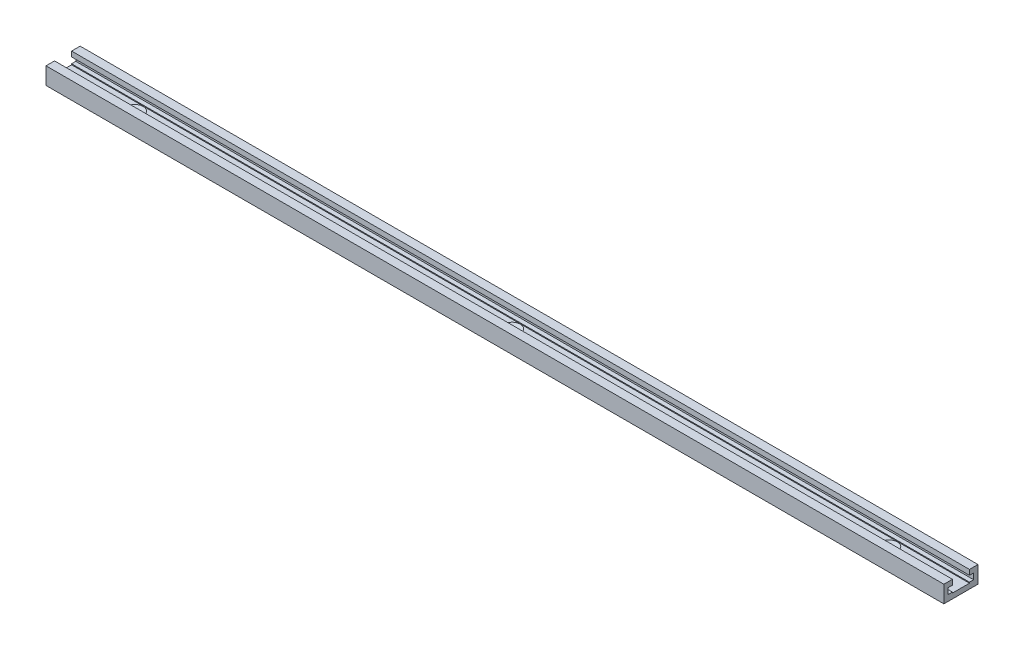
ISO-10303-21;
HEADER;
FILE_DESCRIPTION(('STEP AP214'),'2;1');
FILE_NAME('part.step','',(''),(''),'','','');
FILE_SCHEMA(('AUTOMOTIVE_DESIGN { 1 0 10303 214 1 1 1 1 }'));
ENDSEC;
DATA;
#1=APPLICATION_CONTEXT('core data for automotive mechanical design processes');
#2=APPLICATION_PROTOCOL_DEFINITION('international standard','automotive_design',2000,#1);
#3=PRODUCT_CONTEXT('',#1,'mechanical');
#4=PRODUCT('Part','Part','',(#3));
#5=PRODUCT_RELATED_PRODUCT_CATEGORY('part','',(#4));
#6=PRODUCT_DEFINITION_FORMATION('','',#4);
#7=PRODUCT_DEFINITION_CONTEXT('part definition',#1,'design');
#8=PRODUCT_DEFINITION('design','',#6,#7);
#9=PRODUCT_DEFINITION_SHAPE('','',#8);
#10=(LENGTH_UNIT() NAMED_UNIT(*) SI_UNIT(.MILLI.,.METRE.));
#11=(NAMED_UNIT(*) PLANE_ANGLE_UNIT() SI_UNIT($,.RADIAN.));
#12=(NAMED_UNIT(*) SI_UNIT($,.STERADIAN.) SOLID_ANGLE_UNIT());
#13=UNCERTAINTY_MEASURE_WITH_UNIT(LENGTH_MEASURE(1.E-05),#10,'distance_accuracy_value','');
#14=(GEOMETRIC_REPRESENTATION_CONTEXT(3) GLOBAL_UNCERTAINTY_ASSIGNED_CONTEXT((#13)) GLOBAL_UNIT_ASSIGNED_CONTEXT((#10,
#11,#12)) REPRESENTATION_CONTEXT('',''));
#15=CARTESIAN_POINT('',(0.,0.,0.));
#16=DIRECTION('',(0.,0.,1.));
#17=DIRECTION('',(1.,0.,0.));
#18=AXIS2_PLACEMENT_3D('',#15,#16,#17);
#19=CARTESIAN_POINT('',(250.,-4.75,9.5));
#20=DIRECTION('',(0.,0.,-1.));
#21=DIRECTION('',(-1.,0.,0.));
#22=AXIS2_PLACEMENT_3D('',#19,#20,#21);
#23=PLANE('',#22);
#24=DIRECTION('',(0.,-1.,0.));
#25=VECTOR('',#24,1.);
#26=CARTESIAN_POINT('',(-250.,-4.75,9.5));
#27=LINE('',#26,#25);
#28=CARTESIAN_POINT('',(-250.,4.75,9.5));
#29=VERTEX_POINT('',#28);
#30=CARTESIAN_POINT('',(-250.,-4.75,9.5));
#31=VERTEX_POINT('',#30);
#32=EDGE_CURVE('E184',#29,#31,#27,.T.);
#33=ORIENTED_EDGE('',*,*,#32,.T.);
#34=DIRECTION('',(-1.,0.,0.));
#35=VECTOR('',#34,1.);
#36=CARTESIAN_POINT('',(250.,-4.75,9.5));
#37=LINE('',#36,#35);
#38=CARTESIAN_POINT('',(250.,-4.75,9.5));
#39=VERTEX_POINT('',#38);
#40=EDGE_CURVE('E11',#39,#31,#37,.T.);
#41=ORIENTED_EDGE('',*,*,#40,.F.);
#42=DIRECTION('',(0.,-1.,0.));
#43=VECTOR('',#42,1.);
#44=CARTESIAN_POINT('',(250.,-4.75,9.5));
#45=LINE('',#44,#43);
#46=CARTESIAN_POINT('',(250.,4.75,9.5));
#47=VERTEX_POINT('',#46);
#48=EDGE_CURVE('E215',#47,#39,#45,.T.);
#49=ORIENTED_EDGE('',*,*,#48,.F.);
#50=DIRECTION('',(-1.,0.,0.));
#51=VECTOR('',#50,1.);
#52=CARTESIAN_POINT('',(250.,4.75,9.5));
#53=LINE('',#52,#51);
#54=EDGE_CURVE('E180',#47,#29,#53,.T.);
#55=ORIENTED_EDGE('',*,*,#54,.T.);
#56=EDGE_LOOP('',(#33,#41,#49,#55));
#57=FACE_BOUND('',#56,.T.);
#58=ADVANCED_FACE('F38',(#57),#23,.F.);
#59=CARTESIAN_POINT('',(250.,-4.75,-9.5));
#60=DIRECTION('',(0.,1.,0.));
#61=DIRECTION('',(0.,0.,1.));
#62=AXIS2_PLACEMENT_3D('',#59,#60,#61);
#63=PLANE('',#62);
#64=CARTESIAN_POINT('',(0.,-4.75,0.));
#65=DIRECTION('',(0.,1.,0.));
#66=DIRECTION('',(0.,0.,1.));
#67=AXIS2_PLACEMENT_3D('',#64,#65,#66);
#68=CIRCLE('',#67,2.25);
#69=CARTESIAN_POINT('',(0.,-4.75,2.25));
#70=VERTEX_POINT('',#69);
#71=EDGE_CURVE('E41',#70,#70,#68,.T.);
#72=ORIENTED_EDGE('',*,*,#71,.T.);
#73=EDGE_LOOP('',(#72));
#74=FACE_BOUND('',#73,.T.);
#75=CARTESIAN_POINT('',(-210.,-4.75,0.));
#76=DIRECTION('',(0.,1.,0.));
#77=DIRECTION('',(0.,0.,1.));
#78=AXIS2_PLACEMENT_3D('',#75,#76,#77);
#79=CIRCLE('',#78,2.25);
#80=CARTESIAN_POINT('',(-210.,-4.75,2.25));
#81=VERTEX_POINT('',#80);
#82=EDGE_CURVE('E253',#81,#81,#79,.T.);
#83=ORIENTED_EDGE('',*,*,#82,.T.);
#84=EDGE_LOOP('',(#83));
#85=FACE_BOUND('',#84,.T.);
#86=CARTESIAN_POINT('',(210.,-4.75,0.));
#87=DIRECTION('',(0.,1.,0.));
#88=DIRECTION('',(0.,0.,1.));
#89=AXIS2_PLACEMENT_3D('',#86,#87,#88);
#90=CIRCLE('',#89,2.25);
#91=CARTESIAN_POINT('',(210.,-4.75,2.25));
#92=VERTEX_POINT('',#91);
#93=EDGE_CURVE('E188',#92,#92,#90,.T.);
#94=ORIENTED_EDGE('',*,*,#93,.T.);
#95=EDGE_LOOP('',(#94));
#96=FACE_BOUND('',#95,.T.);
#97=DIRECTION('',(0.,0.,-1.));
#98=VECTOR('',#97,1.);
#99=CARTESIAN_POINT('',(-250.,-4.75,-9.5));
#100=LINE('',#99,#98);
#101=CARTESIAN_POINT('',(-250.,-4.75,-9.5));
#102=VERTEX_POINT('',#101);
#103=EDGE_CURVE('E187',#31,#102,#100,.T.);
#104=ORIENTED_EDGE('',*,*,#103,.T.);
#105=DIRECTION('',(-1.,0.,0.));
#106=VECTOR('',#105,1.);
#107=CARTESIAN_POINT('',(250.,-4.75,-9.5));
#108=LINE('',#107,#106);
#109=CARTESIAN_POINT('',(250.,-4.75,-9.5));
#110=VERTEX_POINT('',#109);
#111=EDGE_CURVE('E47',#110,#102,#108,.T.);
#112=ORIENTED_EDGE('',*,*,#111,.F.);
#113=DIRECTION('',(0.,0.,-1.));
#114=VECTOR('',#113,1.);
#115=CARTESIAN_POINT('',(250.,-4.75,-9.5));
#116=LINE('',#115,#114);
#117=EDGE_CURVE('E123',#39,#110,#116,.T.);
#118=ORIENTED_EDGE('',*,*,#117,.F.);
#119=ORIENTED_EDGE('',*,*,#40,.T.);
#120=EDGE_LOOP('',(#104,#112,#118,#119));
#121=FACE_BOUND('',#120,.T.);
#122=ADVANCED_FACE('F321',(#74,#85,#96,#121),#63,.F.);
#123=CARTESIAN_POINT('',(250.,-4.75,-9.5));
#124=DIRECTION('',(0.,0.,1.));
#125=DIRECTION('',(1.,0.,0.));
#126=AXIS2_PLACEMENT_3D('',#123,#124,#125);
#127=PLANE('',#126);
#128=DIRECTION('',(0.,1.,0.));
#129=VECTOR('',#128,1.);
#130=CARTESIAN_POINT('',(-250.,-4.75,-9.5));
#131=LINE('',#130,#129);
#132=CARTESIAN_POINT('',(-250.,4.75,-9.5));
#133=VERTEX_POINT('',#132);
#134=EDGE_CURVE('E190',#102,#133,#131,.T.);
#135=ORIENTED_EDGE('',*,*,#134,.T.);
#136=DIRECTION('',(-1.,0.,0.));
#137=VECTOR('',#136,1.);
#138=CARTESIAN_POINT('',(250.,4.75,-9.5));
#139=LINE('',#138,#137);
#140=CARTESIAN_POINT('',(250.,4.75,-9.5));
#141=VERTEX_POINT('',#140);
#142=EDGE_CURVE('E246',#141,#133,#139,.T.);
#143=ORIENTED_EDGE('',*,*,#142,.F.);
#144=DIRECTION('',(0.,1.,0.));
#145=VECTOR('',#144,1.);
#146=CARTESIAN_POINT('',(250.,-4.75,-9.5));
#147=LINE('',#146,#145);
#148=EDGE_CURVE('E274',#110,#141,#147,.T.);
#149=ORIENTED_EDGE('',*,*,#148,.F.);
#150=ORIENTED_EDGE('',*,*,#111,.T.);
#151=EDGE_LOOP('',(#135,#143,#149,#150));
#152=FACE_BOUND('',#151,.T.);
#153=ADVANCED_FACE('F325',(#152),#127,.F.);
#154=CARTESIAN_POINT('',(250.,4.75,-9.5));
#155=DIRECTION('',(0.,-1.,0.));
#156=DIRECTION('',(0.,0.,-1.));
#157=AXIS2_PLACEMENT_3D('',#154,#155,#156);
#158=PLANE('',#157);
#159=DIRECTION('',(0.,0.,1.));
#160=VECTOR('',#159,1.);
#161=CARTESIAN_POINT('',(-250.,4.75,-9.5));
#162=LINE('',#161,#160);
#163=CARTESIAN_POINT('',(-250.,4.75,-4.75));
#164=VERTEX_POINT('',#163);
#165=EDGE_CURVE('E192',#133,#164,#162,.T.);
#166=ORIENTED_EDGE('',*,*,#165,.T.);
#167=DIRECTION('',(-1.,0.,0.));
#168=VECTOR('',#167,1.);
#169=CARTESIAN_POINT('',(250.,4.75,-4.75));
#170=LINE('',#169,#168);
#171=CARTESIAN_POINT('',(250.,4.75,-4.75));
#172=VERTEX_POINT('',#171);
#173=EDGE_CURVE('E243',#172,#164,#170,.T.);
#174=ORIENTED_EDGE('',*,*,#173,.F.);
#175=DIRECTION('',(0.,0.,1.));
#176=VECTOR('',#175,1.);
#177=CARTESIAN_POINT('',(250.,4.75,-9.5));
#178=LINE('',#177,#176);
#179=EDGE_CURVE('E276',#141,#172,#178,.T.);
#180=ORIENTED_EDGE('',*,*,#179,.F.);
#181=ORIENTED_EDGE('',*,*,#142,.T.);
#182=EDGE_LOOP('',(#166,#174,#180,#181));
#183=FACE_BOUND('',#182,.T.);
#184=ADVANCED_FACE('F330',(#183),#158,.F.);
#185=CARTESIAN_POINT('',(250.,4.75,-4.75));
#186=DIRECTION('',(0.,0.,-1.));
#187=DIRECTION('',(0.,1.,0.));
#188=AXIS2_PLACEMENT_3D('',#185,#186,#187);
#189=PLANE('',#188);
#190=DIRECTION('',(0.,-1.,0.));
#191=VECTOR('',#190,1.);
#192=CARTESIAN_POINT('',(-250.,4.75,-4.75));
#193=LINE('',#192,#191);
#194=CARTESIAN_POINT('',(-250.,1.9,-4.75));
#195=VERTEX_POINT('',#194);
#196=EDGE_CURVE('E194',#164,#195,#193,.T.);
#197=ORIENTED_EDGE('',*,*,#196,.T.);
#198=DIRECTION('',(-1.,0.,0.));
#199=VECTOR('',#198,1.);
#200=CARTESIAN_POINT('',(250.,1.9,-4.75));
#201=LINE('',#200,#199);
#202=CARTESIAN_POINT('',(250.,1.9,-4.75));
#203=VERTEX_POINT('',#202);
#204=EDGE_CURVE('E240',#203,#195,#201,.T.);
#205=ORIENTED_EDGE('',*,*,#204,.F.);
#206=DIRECTION('',(0.,-1.,0.));
#207=VECTOR('',#206,1.);
#208=CARTESIAN_POINT('',(250.,4.75,-4.75));
#209=LINE('',#208,#207);
#210=EDGE_CURVE('E278',#172,#203,#209,.T.);
#211=ORIENTED_EDGE('',*,*,#210,.F.);
#212=ORIENTED_EDGE('',*,*,#173,.T.);
#213=EDGE_LOOP('',(#197,#205,#211,#212));
#214=FACE_BOUND('',#213,.T.);
#215=ADVANCED_FACE('F337',(#214),#189,.F.);
#216=CARTESIAN_POINT('',(250.,1.9,-4.75));
#217=DIRECTION('',(0.,1.,0.));
#218=DIRECTION('',(0.,0.,1.));
#219=AXIS2_PLACEMENT_3D('',#216,#217,#218);
#220=PLANE('',#219);
#221=DIRECTION('',(0.,0.,-1.));
#222=VECTOR('',#221,1.);
#223=CARTESIAN_POINT('',(-250.,1.9,-4.75));
#224=LINE('',#223,#222);
#225=CARTESIAN_POINT('',(-250.,1.9,-7.1));
#226=VERTEX_POINT('',#225);
#227=EDGE_CURVE('E196',#195,#226,#224,.T.);
#228=ORIENTED_EDGE('',*,*,#227,.T.);
#229=DIRECTION('',(-1.,0.,0.));
#230=VECTOR('',#229,1.);
#231=CARTESIAN_POINT('',(250.,1.9,-7.1));
#232=LINE('',#231,#230);
#233=CARTESIAN_POINT('',(250.,1.9,-7.1));
#234=VERTEX_POINT('',#233);
#235=EDGE_CURVE('E237',#234,#226,#232,.T.);
#236=ORIENTED_EDGE('',*,*,#235,.F.);
#237=DIRECTION('',(0.,0.,-1.));
#238=VECTOR('',#237,1.);
#239=CARTESIAN_POINT('',(250.,1.9,-4.75));
#240=LINE('',#239,#238);
#241=EDGE_CURVE('E280',#203,#234,#240,.T.);
#242=ORIENTED_EDGE('',*,*,#241,.F.);
#243=ORIENTED_EDGE('',*,*,#204,.T.);
#244=EDGE_LOOP('',(#228,#236,#242,#243));
#245=FACE_BOUND('',#244,.T.);
#246=ADVANCED_FACE('F341',(#245),#220,.F.);
#247=CARTESIAN_POINT('',(250.,1.9,-7.1));
#248=DIRECTION('',(0.,0.,-1.));
#249=DIRECTION('',(-1.,0.,0.));
#250=AXIS2_PLACEMENT_3D('',#247,#248,#249);
#251=PLANE('',#250);
#252=DIRECTION('',(0.,-1.,0.));
#253=VECTOR('',#252,1.);
#254=CARTESIAN_POINT('',(-250.,1.9,-7.1));
#255=LINE('',#254,#253);
#256=CARTESIAN_POINT('',(-250.,-1.4,-7.1));
#257=VERTEX_POINT('',#256);
#258=EDGE_CURVE('E198',#226,#257,#255,.T.);
#259=ORIENTED_EDGE('',*,*,#258,.T.);
#260=DIRECTION('',(-1.,0.,0.));
#261=VECTOR('',#260,1.);
#262=CARTESIAN_POINT('',(250.,-1.4,-7.1));
#263=LINE('',#262,#261);
#264=CARTESIAN_POINT('',(250.,-1.4,-7.1));
#265=VERTEX_POINT('',#264);
#266=EDGE_CURVE('E234',#265,#257,#263,.T.);
#267=ORIENTED_EDGE('',*,*,#266,.F.);
#268=DIRECTION('',(0.,-1.,0.));
#269=VECTOR('',#268,1.);
#270=CARTESIAN_POINT('',(250.,1.9,-7.1));
#271=LINE('',#270,#269);
#272=EDGE_CURVE('E282',#234,#265,#271,.T.);
#273=ORIENTED_EDGE('',*,*,#272,.F.);
#274=ORIENTED_EDGE('',*,*,#235,.T.);
#275=EDGE_LOOP('',(#259,#267,#273,#274));
#276=FACE_BOUND('',#275,.T.);
#277=ADVANCED_FACE('F345',(#276),#251,.F.);
#278=CARTESIAN_POINT('',(250.,-1.4,-4.75));
#279=DIRECTION('',(0.,-1.,0.));
#280=DIRECTION('',(0.,0.,-1.));
#281=AXIS2_PLACEMENT_3D('',#278,#279,#280);
#282=PLANE('',#281);
#283=DIRECTION('',(0.,0.,1.));
#284=VECTOR('',#283,1.);
#285=CARTESIAN_POINT('',(-250.,-1.4,-4.75));
#286=LINE('',#285,#284);
#287=CARTESIAN_POINT('',(-250.,-1.4,-4.75));
#288=VERTEX_POINT('',#287);
#289=EDGE_CURVE('E200',#257,#288,#286,.T.);
#290=ORIENTED_EDGE('',*,*,#289,.T.);
#291=DIRECTION('',(-1.,0.,0.));
#292=VECTOR('',#291,1.);
#293=CARTESIAN_POINT('',(250.,-1.4,-4.75));
#294=LINE('',#293,#292);
#295=CARTESIAN_POINT('',(250.,-1.4,-4.75));
#296=VERTEX_POINT('',#295);
#297=EDGE_CURVE('E231',#296,#288,#294,.T.);
#298=ORIENTED_EDGE('',*,*,#297,.F.);
#299=DIRECTION('',(0.,0.,1.));
#300=VECTOR('',#299,1.);
#301=CARTESIAN_POINT('',(250.,-1.4,-4.75));
#302=LINE('',#301,#300);
#303=EDGE_CURVE('E284',#265,#296,#302,.T.);
#304=ORIENTED_EDGE('',*,*,#303,.F.);
#305=ORIENTED_EDGE('',*,*,#266,.T.);
#306=EDGE_LOOP('',(#290,#298,#304,#305));
#307=FACE_BOUND('',#306,.T.);
#308=ADVANCED_FACE('F349',(#307),#282,.F.);
#309=CARTESIAN_POINT('',(250.,-1.4,-4.75));
#310=DIRECTION('',(0.,0.,-1.));
#311=DIRECTION('',(0.,1.,0.));
#312=AXIS2_PLACEMENT_3D('',#309,#310,#311);
#313=PLANE('',#312);
#314=DIRECTION('',(0.,-1.,0.));
#315=VECTOR('',#314,1.);
#316=CARTESIAN_POINT('',(-250.,-1.4,-4.75));
#317=LINE('',#316,#315);
#318=CARTESIAN_POINT('',(-250.,-1.9,-4.75));
#319=VERTEX_POINT('',#318);
#320=EDGE_CURVE('E202',#288,#319,#317,.T.);
#321=ORIENTED_EDGE('',*,*,#320,.T.);
#322=DIRECTION('',(-1.,0.,0.));
#323=VECTOR('',#322,1.);
#324=CARTESIAN_POINT('',(250.,-1.9,-4.75));
#325=LINE('',#324,#323);
#326=CARTESIAN_POINT('',(250.,-1.9,-4.75));
#327=VERTEX_POINT('',#326);
#328=EDGE_CURVE('E228',#327,#319,#325,.T.);
#329=ORIENTED_EDGE('',*,*,#328,.F.);
#330=DIRECTION('',(0.,-1.,0.));
#331=VECTOR('',#330,1.);
#332=CARTESIAN_POINT('',(250.,-1.4,-4.75));
#333=LINE('',#332,#331);
#334=EDGE_CURVE('E286',#296,#327,#333,.T.);
#335=ORIENTED_EDGE('',*,*,#334,.F.);
#336=ORIENTED_EDGE('',*,*,#297,.T.);
#337=EDGE_LOOP('',(#321,#329,#335,#336));
#338=FACE_BOUND('',#337,.T.);
#339=ADVANCED_FACE('F353',(#338),#313,.F.);
#340=CARTESIAN_POINT('',(250.,-1.9,4.75));
#341=DIRECTION('',(0.,-1.,0.));
#342=DIRECTION('',(0.,0.,-1.));
#343=AXIS2_PLACEMENT_3D('',#340,#341,#342);
#344=PLANE('',#343);
#345=CARTESIAN_POINT('',(0.,-1.9,0.));
#346=DIRECTION('',(0.,1.,0.));
#347=DIRECTION('',(0.,0.,1.));
#348=AXIS2_PLACEMENT_3D('',#345,#346,#347);
#349=CIRCLE('',#348,4.59);
#350=CARTESIAN_POINT('',(0.,-1.9,4.59));
#351=VERTEX_POINT('',#350);
#352=EDGE_CURVE('E635',#351,#351,#349,.T.);
#353=ORIENTED_EDGE('',*,*,#352,.F.);
#354=EDGE_LOOP('',(#353));
#355=FACE_BOUND('',#354,.T.);
#356=CARTESIAN_POINT('',(-210.,-1.9,0.));
#357=DIRECTION('',(0.,1.,0.));
#358=DIRECTION('',(0.,0.,1.));
#359=AXIS2_PLACEMENT_3D('',#356,#357,#358);
#360=CIRCLE('',#359,4.59000000000001);
#361=CARTESIAN_POINT('',(-210.,-1.9,4.59000000000001));
#362=VERTEX_POINT('',#361);
#363=EDGE_CURVE('E262',#362,#362,#360,.T.);
#364=ORIENTED_EDGE('',*,*,#363,.F.);
#365=EDGE_LOOP('',(#364));
#366=FACE_BOUND('',#365,.T.);
#367=CARTESIAN_POINT('',(210.,-1.9,0.));
#368=DIRECTION('',(0.,1.,0.));
#369=DIRECTION('',(0.,0.,1.));
#370=AXIS2_PLACEMENT_3D('',#367,#368,#369);
#371=CIRCLE('',#370,4.59000000000001);
#372=CARTESIAN_POINT('',(210.,-1.9,4.59000000000001));
#373=VERTEX_POINT('',#372);
#374=EDGE_CURVE('E255',#373,#373,#371,.T.);
#375=ORIENTED_EDGE('',*,*,#374,.F.);
#376=EDGE_LOOP('',(#375));
#377=FACE_BOUND('',#376,.T.);
#378=DIRECTION('',(0.,0.,1.));
#379=VECTOR('',#378,1.);
#380=CARTESIAN_POINT('',(-250.,-1.9,4.75));
#381=LINE('',#380,#379);
#382=CARTESIAN_POINT('',(-250.,-1.9,4.75));
#383=VERTEX_POINT('',#382);
#384=EDGE_CURVE('E204',#319,#383,#381,.T.);
#385=ORIENTED_EDGE('',*,*,#384,.T.);
#386=DIRECTION('',(-1.,0.,0.));
#387=VECTOR('',#386,1.);
#388=CARTESIAN_POINT('',(250.,-1.9,4.75));
#389=LINE('',#388,#387);
#390=CARTESIAN_POINT('',(250.,-1.9,4.75));
#391=VERTEX_POINT('',#390);
#392=EDGE_CURVE('E225',#391,#383,#389,.T.);
#393=ORIENTED_EDGE('',*,*,#392,.F.);
#394=DIRECTION('',(0.,0.,1.));
#395=VECTOR('',#394,1.);
#396=CARTESIAN_POINT('',(250.,-1.9,4.75));
#397=LINE('',#396,#395);
#398=EDGE_CURVE('E288',#327,#391,#397,.T.);
#399=ORIENTED_EDGE('',*,*,#398,.F.);
#400=ORIENTED_EDGE('',*,*,#328,.T.);
#401=EDGE_LOOP('',(#385,#393,#399,#400));
#402=FACE_BOUND('',#401,.T.);
#403=ADVANCED_FACE('F357',(#355,#366,#377,#402),#344,.F.);
#404=CARTESIAN_POINT('',(250.,-1.4,4.75));
#405=DIRECTION('',(0.,0.,1.));
#406=DIRECTION('',(1.,0.,0.));
#407=AXIS2_PLACEMENT_3D('',#404,#405,#406);
#408=PLANE('',#407);
#409=DIRECTION('',(0.,1.,0.));
#410=VECTOR('',#409,1.);
#411=CARTESIAN_POINT('',(-250.,-1.4,4.75));
#412=LINE('',#411,#410);
#413=CARTESIAN_POINT('',(-250.,-1.4,4.75));
#414=VERTEX_POINT('',#413);
#415=EDGE_CURVE('E206',#383,#414,#412,.T.);
#416=ORIENTED_EDGE('',*,*,#415,.T.);
#417=DIRECTION('',(-1.,0.,0.));
#418=VECTOR('',#417,1.);
#419=CARTESIAN_POINT('',(250.,-1.4,4.75));
#420=LINE('',#419,#418);
#421=CARTESIAN_POINT('',(250.,-1.4,4.75));
#422=VERTEX_POINT('',#421);
#423=EDGE_CURVE('E222',#422,#414,#420,.T.);
#424=ORIENTED_EDGE('',*,*,#423,.F.);
#425=DIRECTION('',(0.,1.,0.));
#426=VECTOR('',#425,1.);
#427=CARTESIAN_POINT('',(250.,-1.4,4.75));
#428=LINE('',#427,#426);
#429=EDGE_CURVE('E290',#391,#422,#428,.T.);
#430=ORIENTED_EDGE('',*,*,#429,.F.);
#431=ORIENTED_EDGE('',*,*,#392,.T.);
#432=EDGE_LOOP('',(#416,#424,#430,#431));
#433=FACE_BOUND('',#432,.T.);
#434=ADVANCED_FACE('F361',(#433),#408,.F.);
#435=CARTESIAN_POINT('',(250.,-1.4,7.1));
#436=DIRECTION('',(0.,-1.,0.));
#437=DIRECTION('',(0.,0.,-1.));
#438=AXIS2_PLACEMENT_3D('',#435,#436,#437);
#439=PLANE('',#438);
#440=DIRECTION('',(0.,0.,1.));
#441=VECTOR('',#440,1.);
#442=CARTESIAN_POINT('',(-250.,-1.4,7.1));
#443=LINE('',#442,#441);
#444=CARTESIAN_POINT('',(-250.,-1.4,7.1));
#445=VERTEX_POINT('',#444);
#446=EDGE_CURVE('E208',#414,#445,#443,.T.);
#447=ORIENTED_EDGE('',*,*,#446,.T.);
#448=DIRECTION('',(-1.,0.,0.));
#449=VECTOR('',#448,1.);
#450=CARTESIAN_POINT('',(250.,-1.4,7.1));
#451=LINE('',#450,#449);
#452=CARTESIAN_POINT('',(250.,-1.4,7.1));
#453=VERTEX_POINT('',#452);
#454=EDGE_CURVE('E219',#453,#445,#451,.T.);
#455=ORIENTED_EDGE('',*,*,#454,.F.);
#456=DIRECTION('',(0.,0.,1.));
#457=VECTOR('',#456,1.);
#458=CARTESIAN_POINT('',(250.,-1.4,7.1));
#459=LINE('',#458,#457);
#460=EDGE_CURVE('E292',#422,#453,#459,.T.);
#461=ORIENTED_EDGE('',*,*,#460,.F.);
#462=ORIENTED_EDGE('',*,*,#423,.T.);
#463=EDGE_LOOP('',(#447,#455,#461,#462));
#464=FACE_BOUND('',#463,.T.);
#465=ADVANCED_FACE('F298',(#464),#439,.F.);
#466=CARTESIAN_POINT('',(250.,1.9,7.1));
#467=DIRECTION('',(0.,0.,1.));
#468=DIRECTION('',(1.,0.,0.));
#469=AXIS2_PLACEMENT_3D('',#466,#467,#468);
#470=PLANE('',#469);
#471=DIRECTION('',(0.,1.,0.));
#472=VECTOR('',#471,1.);
#473=CARTESIAN_POINT('',(-250.,1.9,7.1));
#474=LINE('',#473,#472);
#475=CARTESIAN_POINT('',(-250.,1.9,7.1));
#476=VERTEX_POINT('',#475);
#477=EDGE_CURVE('E210',#445,#476,#474,.T.);
#478=ORIENTED_EDGE('',*,*,#477,.T.);
#479=DIRECTION('',(-1.,0.,0.));
#480=VECTOR('',#479,1.);
#481=CARTESIAN_POINT('',(250.,1.9,7.1));
#482=LINE('',#481,#480);
#483=CARTESIAN_POINT('',(250.,1.9,7.1));
#484=VERTEX_POINT('',#483);
#485=EDGE_CURVE('E175',#484,#476,#482,.T.);
#486=ORIENTED_EDGE('',*,*,#485,.F.);
#487=DIRECTION('',(0.,1.,0.));
#488=VECTOR('',#487,1.);
#489=CARTESIAN_POINT('',(250.,1.9,7.1));
#490=LINE('',#489,#488);
#491=EDGE_CURVE('E166',#453,#484,#490,.T.);
#492=ORIENTED_EDGE('',*,*,#491,.F.);
#493=ORIENTED_EDGE('',*,*,#454,.T.);
#494=EDGE_LOOP('',(#478,#486,#492,#493));
#495=FACE_BOUND('',#494,.T.);
#496=ADVANCED_FACE('F302',(#495),#470,.F.);
#497=CARTESIAN_POINT('',(250.,1.9,7.1));
#498=DIRECTION('',(0.,1.,0.));
#499=DIRECTION('',(0.,0.,1.));
#500=AXIS2_PLACEMENT_3D('',#497,#498,#499);
#501=PLANE('',#500);
#502=DIRECTION('',(0.,0.,-1.));
#503=VECTOR('',#502,1.);
#504=CARTESIAN_POINT('',(-250.,1.9,7.1));
#505=LINE('',#504,#503);
#506=CARTESIAN_POINT('',(-250.,1.90000000000001,4.75));
#507=VERTEX_POINT('',#506);
#508=EDGE_CURVE('E174',#476,#507,#505,.T.);
#509=ORIENTED_EDGE('',*,*,#508,.T.);
#510=DIRECTION('',(-1.,0.,0.));
#511=VECTOR('',#510,1.);
#512=CARTESIAN_POINT('',(250.,1.90000000000001,4.75));
#513=LINE('',#512,#511);
#514=CARTESIAN_POINT('',(250.,1.90000000000001,4.75));
#515=VERTEX_POINT('',#514);
#516=EDGE_CURVE('E171',#515,#507,#513,.T.);
#517=ORIENTED_EDGE('',*,*,#516,.F.);
#518=DIRECTION('',(0.,0.,-1.));
#519=VECTOR('',#518,1.);
#520=CARTESIAN_POINT('',(250.,1.9,7.1));
#521=LINE('',#520,#519);
#522=EDGE_CURVE('E160',#484,#515,#521,.T.);
#523=ORIENTED_EDGE('',*,*,#522,.F.);
#524=ORIENTED_EDGE('',*,*,#485,.T.);
#525=EDGE_LOOP('',(#509,#517,#523,#524));
#526=FACE_BOUND('',#525,.T.);
#527=ADVANCED_FACE('F172',(#526),#501,.F.);
#528=CARTESIAN_POINT('',(250.,4.75,4.75));
#529=DIRECTION('',(0.,0.,1.));
#530=DIRECTION('',(0.,-1.,0.));
#531=AXIS2_PLACEMENT_3D('',#528,#529,#530);
#532=PLANE('',#531);
#533=DIRECTION('',(0.,1.,0.));
#534=VECTOR('',#533,1.);
#535=CARTESIAN_POINT('',(-250.,4.75,4.75));
#536=LINE('',#535,#534);
#537=CARTESIAN_POINT('',(-250.,4.75,4.75));
#538=VERTEX_POINT('',#537);
#539=EDGE_CURVE('E109',#507,#538,#536,.T.);
#540=ORIENTED_EDGE('',*,*,#539,.T.);
#541=DIRECTION('',(-1.,0.,0.));
#542=VECTOR('',#541,1.);
#543=CARTESIAN_POINT('',(250.,4.75,4.75));
#544=LINE('',#543,#542);
#545=CARTESIAN_POINT('',(250.,4.75,4.75));
#546=VERTEX_POINT('',#545);
#547=EDGE_CURVE('E176',#546,#538,#544,.T.);
#548=ORIENTED_EDGE('',*,*,#547,.F.);
#549=DIRECTION('',(0.,1.,0.));
#550=VECTOR('',#549,1.);
#551=CARTESIAN_POINT('',(250.,4.75,4.75));
#552=LINE('',#551,#550);
#553=EDGE_CURVE('E164',#515,#546,#552,.T.);
#554=ORIENTED_EDGE('',*,*,#553,.F.);
#555=ORIENTED_EDGE('',*,*,#516,.T.);
#556=EDGE_LOOP('',(#540,#548,#554,#555));
#557=FACE_BOUND('',#556,.T.);
#558=ADVANCED_FACE('F178',(#557),#532,.F.);
#559=CARTESIAN_POINT('',(250.,4.75,4.75));
#560=DIRECTION('',(0.,-1.,0.));
#561=DIRECTION('',(0.,0.,-1.));
#562=AXIS2_PLACEMENT_3D('',#559,#560,#561);
#563=PLANE('',#562);
#564=DIRECTION('',(0.,0.,1.));
#565=VECTOR('',#564,1.);
#566=CARTESIAN_POINT('',(-250.,4.75,4.75));
#567=LINE('',#566,#565);
#568=EDGE_CURVE('E115',#538,#29,#567,.T.);
#569=ORIENTED_EDGE('',*,*,#568,.T.);
#570=ORIENTED_EDGE('',*,*,#54,.F.);
#571=DIRECTION('',(0.,0.,1.));
#572=VECTOR('',#571,1.);
#573=CARTESIAN_POINT('',(250.,4.75,4.75));
#574=LINE('',#573,#572);
#575=EDGE_CURVE('E56',#546,#47,#574,.T.);
#576=ORIENTED_EDGE('',*,*,#575,.F.);
#577=ORIENTED_EDGE('',*,*,#547,.T.);
#578=EDGE_LOOP('',(#569,#570,#576,#577));
#579=FACE_BOUND('',#578,.T.);
#580=ADVANCED_FACE('F310',(#579),#563,.F.);
#581=CARTESIAN_POINT('',(250.,0.,0.));
#582=DIRECTION('',(1.,0.,0.));
#583=DIRECTION('',(0.,0.,-1.));
#584=AXIS2_PLACEMENT_3D('',#581,#582,#583);
#585=PLANE('',#584);
#586=ORIENTED_EDGE('',*,*,#48,.T.);
#587=ORIENTED_EDGE('',*,*,#117,.T.);
#588=ORIENTED_EDGE('',*,*,#148,.T.);
#589=ORIENTED_EDGE('',*,*,#179,.T.);
#590=ORIENTED_EDGE('',*,*,#210,.T.);
#591=ORIENTED_EDGE('',*,*,#241,.T.);
#592=ORIENTED_EDGE('',*,*,#272,.T.);
#593=ORIENTED_EDGE('',*,*,#303,.T.);
#594=ORIENTED_EDGE('',*,*,#334,.T.);
#595=ORIENTED_EDGE('',*,*,#398,.T.);
#596=ORIENTED_EDGE('',*,*,#429,.T.);
#597=ORIENTED_EDGE('',*,*,#460,.T.);
#598=ORIENTED_EDGE('',*,*,#491,.T.);
#599=ORIENTED_EDGE('',*,*,#522,.T.);
#600=ORIENTED_EDGE('',*,*,#553,.T.);
#601=ORIENTED_EDGE('',*,*,#575,.T.);
#602=EDGE_LOOP('',(#586,#587,#588,#589,#590,#591,#592,#593,#594,#595,#596,#597,#598,#599,#600,#601));
#603=FACE_BOUND('',#602,.T.);
#604=ADVANCED_FACE('F162',(#603),#585,.T.);
#605=CARTESIAN_POINT('',(-250.,0.,0.));
#606=DIRECTION('',(1.,0.,0.));
#607=DIRECTION('',(0.,0.,-1.));
#608=AXIS2_PLACEMENT_3D('',#605,#606,#607);
#609=PLANE('',#608);
#610=ORIENTED_EDGE('',*,*,#32,.F.);
#611=ORIENTED_EDGE('',*,*,#568,.F.);
#612=ORIENTED_EDGE('',*,*,#539,.F.);
#613=ORIENTED_EDGE('',*,*,#508,.F.);
#614=ORIENTED_EDGE('',*,*,#477,.F.);
#615=ORIENTED_EDGE('',*,*,#446,.F.);
#616=ORIENTED_EDGE('',*,*,#415,.F.);
#617=ORIENTED_EDGE('',*,*,#384,.F.);
#618=ORIENTED_EDGE('',*,*,#320,.F.);
#619=ORIENTED_EDGE('',*,*,#289,.F.);
#620=ORIENTED_EDGE('',*,*,#258,.F.);
#621=ORIENTED_EDGE('',*,*,#227,.F.);
#622=ORIENTED_EDGE('',*,*,#196,.F.);
#623=ORIENTED_EDGE('',*,*,#165,.F.);
#624=ORIENTED_EDGE('',*,*,#134,.F.);
#625=ORIENTED_EDGE('',*,*,#103,.F.);
#626=EDGE_LOOP('',(#610,#611,#612,#613,#614,#615,#616,#617,#618,#619,#620,#621,#622,#623,#624,#625));
#627=FACE_BOUND('',#626,.T.);
#628=ADVANCED_FACE('F305',(#627),#609,.F.);
#629=CARTESIAN_POINT('',(210.,-1.9,0.));
#630=DIRECTION('',(0.,1.,0.));
#631=DIRECTION('',(0.,0.,1.));
#632=AXIS2_PLACEMENT_3D('',#629,#630,#631);
#633=CYLINDRICAL_SURFACE('',#632,2.25);
#634=CARTESIAN_POINT('',(210.,-4.24,0.));
#635=DIRECTION('',(0.,1.,0.));
#636=DIRECTION('',(0.,0.,1.));
#637=AXIS2_PLACEMENT_3D('',#634,#635,#636);
#638=CIRCLE('',#637,2.25);
#639=CARTESIAN_POINT('',(210.,-4.24,2.25));
#640=VERTEX_POINT('',#639);
#641=EDGE_CURVE('E252',#640,#640,#638,.T.);
#642=ORIENTED_EDGE('',*,*,#641,.T.);
#643=EDGE_LOOP('',(#642));
#644=FACE_BOUND('',#643,.T.);
#645=ORIENTED_EDGE('',*,*,#93,.F.);
#646=EDGE_LOOP('',(#645));
#647=FACE_BOUND('',#646,.T.);
#648=ADVANCED_FACE('F398',(#644,#647),#633,.F.);
#649=CARTESIAN_POINT('',(210.,-1.9,0.));
#650=DIRECTION('',(0.,1.,0.));
#651=DIRECTION('',(0.,0.,1.));
#652=AXIS2_PLACEMENT_3D('',#649,#650,#651);
#653=CONICAL_SURFACE('',#652,4.59000000000001,0.78539816339745);
#654=ORIENTED_EDGE('',*,*,#641,.F.);
#655=EDGE_LOOP('',(#654));
#656=FACE_BOUND('',#655,.T.);
#657=ORIENTED_EDGE('',*,*,#374,.T.);
#658=EDGE_LOOP('',(#657));
#659=FACE_BOUND('',#658,.T.);
#660=ADVANCED_FACE('F407',(#656,#659),#653,.F.);
#661=CARTESIAN_POINT('',(-210.,-1.9,0.));
#662=DIRECTION('',(0.,1.,0.));
#663=DIRECTION('',(0.,0.,1.));
#664=AXIS2_PLACEMENT_3D('',#661,#662,#663);
#665=CYLINDRICAL_SURFACE('',#664,2.25);
#666=CARTESIAN_POINT('',(-210.,-4.24,0.));
#667=DIRECTION('',(0.,1.,0.));
#668=DIRECTION('',(0.,0.,1.));
#669=AXIS2_PLACEMENT_3D('',#666,#667,#668);
#670=CIRCLE('',#669,2.25);
#671=CARTESIAN_POINT('',(-210.,-4.24,2.25));
#672=VERTEX_POINT('',#671);
#673=EDGE_CURVE('E256',#672,#672,#670,.T.);
#674=ORIENTED_EDGE('',*,*,#673,.T.);
#675=EDGE_LOOP('',(#674));
#676=FACE_BOUND('',#675,.T.);
#677=ORIENTED_EDGE('',*,*,#82,.F.);
#678=EDGE_LOOP('',(#677));
#679=FACE_BOUND('',#678,.T.);
#680=ADVANCED_FACE('F418',(#676,#679),#665,.F.);
#681=CARTESIAN_POINT('',(-210.,-1.9,0.));
#682=DIRECTION('',(0.,1.,0.));
#683=DIRECTION('',(0.,0.,1.));
#684=AXIS2_PLACEMENT_3D('',#681,#682,#683);
#685=CONICAL_SURFACE('',#684,4.59000000000001,0.78539816339745);
#686=ORIENTED_EDGE('',*,*,#673,.F.);
#687=EDGE_LOOP('',(#686));
#688=FACE_BOUND('',#687,.T.);
#689=ORIENTED_EDGE('',*,*,#363,.T.);
#690=EDGE_LOOP('',(#689));
#691=FACE_BOUND('',#690,.T.);
#692=ADVANCED_FACE('F428',(#688,#691),#685,.F.);
#693=CARTESIAN_POINT('',(0.,-1.9,0.));
#694=DIRECTION('',(0.,1.,0.));
#695=DIRECTION('',(0.,0.,1.));
#696=AXIS2_PLACEMENT_3D('',#693,#694,#695);
#697=CYLINDRICAL_SURFACE('',#696,2.25);
#698=CARTESIAN_POINT('',(0.,-4.24,0.));
#699=DIRECTION('',(0.,1.,0.));
#700=DIRECTION('',(0.,0.,1.));
#701=AXIS2_PLACEMENT_3D('',#698,#699,#700);
#702=CIRCLE('',#701,2.25);
#703=CARTESIAN_POINT('',(0.,-4.24,2.25));
#704=VERTEX_POINT('',#703);
#705=EDGE_CURVE('E632',#704,#704,#702,.T.);
#706=ORIENTED_EDGE('',*,*,#705,.T.);
#707=EDGE_LOOP('',(#706));
#708=FACE_BOUND('',#707,.T.);
#709=ORIENTED_EDGE('',*,*,#71,.F.);
#710=EDGE_LOOP('',(#709));
#711=FACE_BOUND('',#710,.T.);
#712=ADVANCED_FACE('F437',(#708,#711),#697,.F.);
#713=CARTESIAN_POINT('',(0.,-1.9,0.));
#714=DIRECTION('',(0.,1.,0.));
#715=DIRECTION('',(0.,0.,1.));
#716=AXIS2_PLACEMENT_3D('',#713,#714,#715);
#717=CONICAL_SURFACE('',#716,4.59,0.785398163397448);
#718=ORIENTED_EDGE('',*,*,#705,.F.);
#719=EDGE_LOOP('',(#718));
#720=FACE_BOUND('',#719,.T.);
#721=ORIENTED_EDGE('',*,*,#352,.T.);
#722=EDGE_LOOP('',(#721));
#723=FACE_BOUND('',#722,.T.);
#724=ADVANCED_FACE('F447',(#720,#723),#717,.F.);
#725=CLOSED_SHELL('',(#58,#122,#153,#184,#215,#246,#277,#308,#339,#403,#434,#465,#496,#527,#558,
#580,#604,#628,#648,#660,#680,#692,#712,#724));
#726=MANIFOLD_SOLID_BREP('B2',#725);
#727=ADVANCED_BREP_SHAPE_REPRESENTATION('',(#18,#726),#14);
#728=SHAPE_DEFINITION_REPRESENTATION(#9,#727);
ENDSEC;
END-ISO-10303-21;
